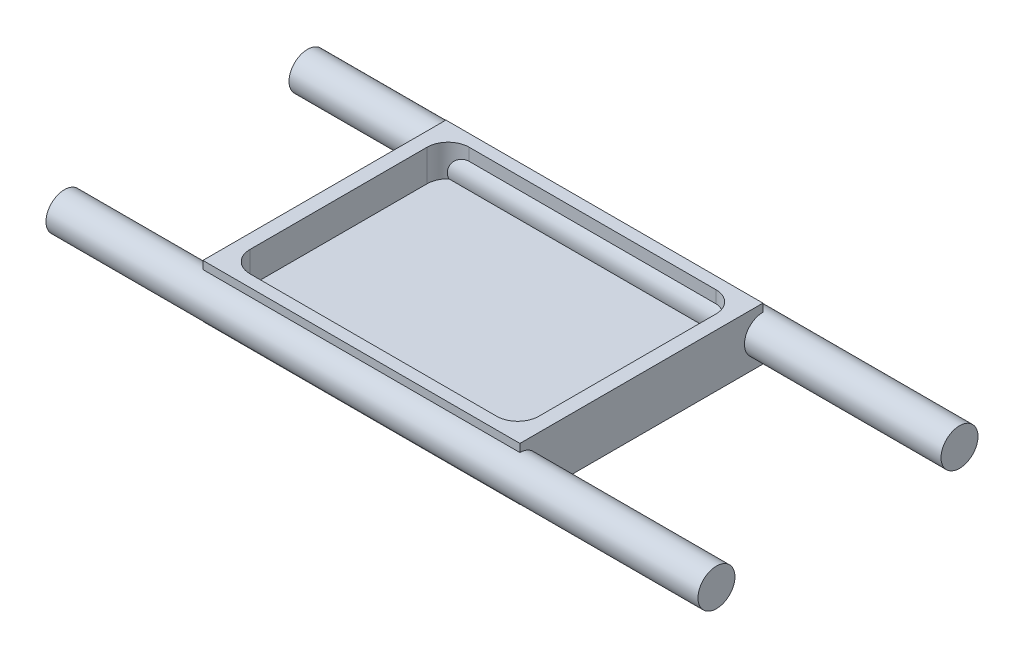
ISO-10303-21;
HEADER;
FILE_DESCRIPTION(('STEP AP214'),'2;1');
FILE_NAME('part.step','',(''),(''),'','','');
FILE_SCHEMA(('AUTOMOTIVE_DESIGN { 1 0 10303 214 1 1 1 1 }'));
ENDSEC;
DATA;
#1=APPLICATION_CONTEXT('core data for automotive mechanical design processes');
#2=APPLICATION_PROTOCOL_DEFINITION('international standard','automotive_design',2000,#1);
#3=PRODUCT_CONTEXT('',#1,'mechanical');
#4=PRODUCT('Part','Part','',(#3));
#5=PRODUCT_RELATED_PRODUCT_CATEGORY('part','',(#4));
#6=PRODUCT_DEFINITION_FORMATION('','',#4);
#7=PRODUCT_DEFINITION_CONTEXT('part definition',#1,'design');
#8=PRODUCT_DEFINITION('design','',#6,#7);
#9=PRODUCT_DEFINITION_SHAPE('','',#8);
#10=(LENGTH_UNIT() NAMED_UNIT(*) SI_UNIT(.MILLI.,.METRE.));
#11=(NAMED_UNIT(*) PLANE_ANGLE_UNIT() SI_UNIT($,.RADIAN.));
#12=(NAMED_UNIT(*) SI_UNIT($,.STERADIAN.) SOLID_ANGLE_UNIT());
#13=UNCERTAINTY_MEASURE_WITH_UNIT(LENGTH_MEASURE(1.E-05),#10,'distance_accuracy_value','');
#14=(GEOMETRIC_REPRESENTATION_CONTEXT(3) GLOBAL_UNCERTAINTY_ASSIGNED_CONTEXT((#13)) GLOBAL_UNIT_ASSIGNED_CONTEXT((#10,
#11,#12)) REPRESENTATION_CONTEXT('',''));
#15=CARTESIAN_POINT('',(0.,0.,0.));
#16=DIRECTION('',(0.,0.,1.));
#17=DIRECTION('',(1.,0.,0.));
#18=AXIS2_PLACEMENT_3D('',#15,#16,#17);
#19=CARTESIAN_POINT('',(116.702187757243,20.,83.7471960657648));
#20=DIRECTION('',(0.,1.,0.));
#21=DIRECTION('',(0.,0.,1.));
#22=AXIS2_PLACEMENT_3D('',#19,#20,#21);
#23=PLANE('',#22);
#24=CARTESIAN_POINT('',(-116.702187757243,20.,83.7471960657648));
#25=DIRECTION('',(0.,1.,0.));
#26=DIRECTION('',(0.,0.,1.));
#27=AXIS2_PLACEMENT_3D('',#24,#25,#26);
#28=CIRCLE('',#27,20.);
#29=CARTESIAN_POINT('',(-136.702187757243,20.,83.7471960657646));
#30=VERTEX_POINT('',#29);
#31=CARTESIAN_POINT('',(-130.495778932662,20.,98.2294901687516));
#32=VERTEX_POINT('',#31);
#33=EDGE_CURVE('E289',#30,#32,#28,.T.);
#34=ORIENTED_EDGE('',*,*,#33,.T.);
#35=DIRECTION('',(-1.,0.,0.));
#36=VECTOR('',#35,1.);
#37=CARTESIAN_POINT('',(336.,20.,98.2294901687515));
#38=LINE('',#37,#36);
#39=CARTESIAN_POINT('',(130.495778932662,20.,98.2294901687515));
#40=VERTEX_POINT('',#39);
#41=EDGE_CURVE('E198',#32,#40,#38,.F.);
#42=ORIENTED_EDGE('',*,*,#41,.T.);
#43=CARTESIAN_POINT('',(116.702187757243,20.,83.7471960657648));
#44=DIRECTION('',(0.,1.,0.));
#45=DIRECTION('',(0.,0.,1.));
#46=AXIS2_PLACEMENT_3D('',#43,#44,#45);
#47=CIRCLE('',#46,20.);
#48=CARTESIAN_POINT('',(136.702187757243,20.,83.7471960657646));
#49=VERTEX_POINT('',#48);
#50=EDGE_CURVE('E333',#40,#49,#47,.T.);
#51=ORIENTED_EDGE('',*,*,#50,.T.);
#52=DIRECTION('',(0.,0.,-1.));
#53=VECTOR('',#52,1.);
#54=CARTESIAN_POINT('',(136.702187757243,20.,-83.7471960657646));
#55=LINE('',#54,#53);
#56=CARTESIAN_POINT('',(136.702187757243,20.,-83.7471960657646));
#57=VERTEX_POINT('',#56);
#58=EDGE_CURVE('E409',#49,#57,#55,.T.);
#59=ORIENTED_EDGE('',*,*,#58,.T.);
#60=CARTESIAN_POINT('',(116.702187757243,20.,-83.7471960657648));
#61=DIRECTION('',(0.,1.,0.));
#62=DIRECTION('',(0.,0.,-1.));
#63=AXIS2_PLACEMENT_3D('',#60,#61,#62);
#64=CIRCLE('',#63,20.);
#65=CARTESIAN_POINT('',(130.495778932662,20.,-98.2294901687516));
#66=VERTEX_POINT('',#65);
#67=EDGE_CURVE('E402',#57,#66,#64,.T.);
#68=ORIENTED_EDGE('',*,*,#67,.T.);
#69=DIRECTION('',(-1.,0.,0.));
#70=VECTOR('',#69,1.);
#71=CARTESIAN_POINT('',(336.,20.,-98.2294901687517));
#72=LINE('',#71,#70);
#73=CARTESIAN_POINT('',(-130.495778932662,20.,-98.2294901687516));
#74=VERTEX_POINT('',#73);
#75=EDGE_CURVE('E54',#66,#74,#72,.T.);
#76=ORIENTED_EDGE('',*,*,#75,.T.);
#77=CARTESIAN_POINT('',(-116.702187757243,20.,-83.7471960657648));
#78=DIRECTION('',(0.,1.,0.));
#79=DIRECTION('',(0.,0.,1.));
#80=AXIS2_PLACEMENT_3D('',#77,#78,#79);
#81=CIRCLE('',#80,20.);
#82=CARTESIAN_POINT('',(-136.702187757243,20.,-83.7471960657646));
#83=VERTEX_POINT('',#82);
#84=EDGE_CURVE('E300',#74,#83,#81,.T.);
#85=ORIENTED_EDGE('',*,*,#84,.T.);
#86=DIRECTION('',(0.,0.,1.));
#87=VECTOR('',#86,1.);
#88=CARTESIAN_POINT('',(-136.702187757243,20.,-83.7471960657646));
#89=LINE('',#88,#87);
#90=EDGE_CURVE('E291',#83,#30,#89,.T.);
#91=ORIENTED_EDGE('',*,*,#90,.T.);
#92=EDGE_LOOP('',(#34,#42,#51,#59,#68,#76,#85,#91));
#93=FACE_BOUND('',#92,.T.);
#94=ADVANCED_FACE('F39',(#93),#23,.T.);
#95=CARTESIAN_POINT('',(150.,50.,115.));
#96=DIRECTION('',(0.,0.,-1.));
#97=DIRECTION('',(-1.,0.,0.));
#98=AXIS2_PLACEMENT_3D('',#95,#96,#97);
#99=PLANE('',#98);
#100=DIRECTION('',(-1.,0.,0.));
#101=VECTOR('',#100,1.);
#102=CARTESIAN_POINT('',(336.,7.5,115.));
#103=LINE('',#102,#101);
#104=CARTESIAN_POINT('',(-150.,7.49999999999999,115.));
#105=VERTEX_POINT('',#104);
#106=CARTESIAN_POINT('',(150.,7.5,115.));
#107=VERTEX_POINT('',#106);
#108=EDGE_CURVE('E61',#105,#107,#103,.F.);
#109=ORIENTED_EDGE('',*,*,#108,.F.);
#110=DIRECTION('',(0.,-1.,0.));
#111=VECTOR('',#110,1.);
#112=CARTESIAN_POINT('',(-150.,50.,115.));
#113=LINE('',#112,#111);
#114=CARTESIAN_POINT('',(-150.,0.,115.));
#115=VERTEX_POINT('',#114);
#116=EDGE_CURVE('E392',#105,#115,#113,.T.);
#117=ORIENTED_EDGE('',*,*,#116,.T.);
#118=DIRECTION('',(1.,0.,0.));
#119=VECTOR('',#118,1.);
#120=CARTESIAN_POINT('',(150.,0.,115.));
#121=LINE('',#120,#119);
#122=CARTESIAN_POINT('',(150.,0.,115.));
#123=VERTEX_POINT('',#122);
#124=EDGE_CURVE('E368',#115,#123,#121,.T.);
#125=ORIENTED_EDGE('',*,*,#124,.T.);
#126=DIRECTION('',(0.,-1.,0.));
#127=VECTOR('',#126,1.);
#128=CARTESIAN_POINT('',(150.,50.,115.));
#129=LINE('',#128,#127);
#130=EDGE_CURVE('E388',#107,#123,#129,.T.);
#131=ORIENTED_EDGE('',*,*,#130,.F.);
#132=EDGE_LOOP('',(#109,#117,#125,#131));
#133=FACE_BOUND('',#132,.T.);
#134=ADVANCED_FACE('F283',(#133),#99,.F.);
#135=DIRECTION('',(-1.,0.,0.));
#136=VECTOR('',#135,1.);
#137=CARTESIAN_POINT('',(336.,42.5,115.));
#138=LINE('',#137,#136);
#139=CARTESIAN_POINT('',(150.,42.5,115.));
#140=VERTEX_POINT('',#139);
#141=CARTESIAN_POINT('',(-150.,42.5,115.));
#142=VERTEX_POINT('',#141);
#143=EDGE_CURVE('E207',#140,#142,#138,.T.);
#144=ORIENTED_EDGE('',*,*,#143,.F.);
#145=CARTESIAN_POINT('',(150.,50.,115.));
#146=VERTEX_POINT('',#145);
#147=EDGE_CURVE('E389',#146,#140,#129,.T.);
#148=ORIENTED_EDGE('',*,*,#147,.F.);
#149=DIRECTION('',(1.,0.,0.));
#150=VECTOR('',#149,1.);
#151=CARTESIAN_POINT('',(150.,50.,115.));
#152=LINE('',#151,#150);
#153=CARTESIAN_POINT('',(-150.,50.,115.));
#154=VERTEX_POINT('',#153);
#155=EDGE_CURVE('E354',#154,#146,#152,.T.);
#156=ORIENTED_EDGE('',*,*,#155,.F.);
#157=EDGE_CURVE('E393',#154,#142,#113,.T.);
#158=ORIENTED_EDGE('',*,*,#157,.T.);
#159=EDGE_LOOP('',(#144,#148,#156,#158));
#160=FACE_BOUND('',#159,.T.);
#161=ADVANCED_FACE('F287',(#160),#99,.F.);
#162=CARTESIAN_POINT('',(116.702187757243,20.,83.7471960657648));
#163=DIRECTION('',(0.,1.,0.));
#164=DIRECTION('',(0.,0.,1.));
#165=AXIS2_PLACEMENT_3D('',#162,#163,#164);
#166=CYLINDRICAL_SURFACE('',#165,20.);
#167=CARTESIAN_POINT('',(116.702187757243,38.402402904616,103.747196065765));
#168=CARTESIAN_POINT('',(116.906678555119,38.4023982148654,103.747197549759));
#169=CARTESIAN_POINT('',(117.111147008417,38.3997698950823,103.744059143717));
#170=CARTESIAN_POINT('',(117.519758220783,38.3892323205855,103.731523876265));
#171=CARTESIAN_POINT('',(117.723900975679,38.381322998747,103.722126935306));
#172=CARTESIAN_POINT('',(118.335415928774,38.3496228799349,103.684580138223));
#173=CARTESIAN_POINT('',(118.741870231253,38.3178599282645,103.647074308818));
#174=CARTESIAN_POINT('',(119.550782386161,38.232332580036,103.547503579904));
#175=CARTESIAN_POINT('',(119.953222278895,38.1784948021762,103.485356791693));
#176=CARTESIAN_POINT('',(120.749958737994,38.0478206758061,103.337491173336));
#177=CARTESIAN_POINT('',(121.144255821356,37.9709857922422,103.251773844693));
#178=CARTESIAN_POINT('',(121.922686521989,37.7928214154587,103.058012179541));
#179=CARTESIAN_POINT('',(122.306795177996,37.6914370015051,102.949917862365));
#180=CARTESIAN_POINT('',(123.0608799563,37.4627657818275,102.71356467234));
#181=CARTESIAN_POINT('',(123.430855797211,37.3354784606944,102.585305398266));
#182=CARTESIAN_POINT('',(124.152901674959,37.0537141206852,102.311561621555));
#183=CARTESIAN_POINT('',(124.505001238333,36.8992839508913,102.16610693791));
#184=CARTESIAN_POINT('',(125.188814340381,36.5617350569814,101.861203806826));
#185=CARTESIAN_POINT('',(125.520529436823,36.3786185288641,101.701756430967));
#186=CARTESIAN_POINT('',(126.14481796031,35.9924868112782,101.381077852782));
#187=CARTESIAN_POINT('',(126.438514251678,35.7908942278777,101.220320532756));
#188=CARTESIAN_POINT('',(127.002438854527,35.3606010409812,100.893943903815));
#189=CARTESIAN_POINT('',(127.272667794866,35.1319011642715,100.728324725343));
#190=CARTESIAN_POINT('',(127.787658094589,34.6477883181661,100.396705421904));
#191=CARTESIAN_POINT('',(128.0324251397,34.3923813382117,100.230705390483));
#192=CARTESIAN_POINT('',(128.495129853448,33.8558726553782,99.9029050349177));
#193=CARTESIAN_POINT('',(128.713069715974,33.5747730568863,99.7411043682115));
#194=CARTESIAN_POINT('',(129.10138429332,33.017240185324,99.4415929971519));
#195=CARTESIAN_POINT('',(129.274324760467,32.7430235673885,99.3030715526013));
#196=CARTESIAN_POINT('',(129.59748137678,32.1768207632072,99.0362549682168));
#197=CARTESIAN_POINT('',(129.747699088705,31.8848358009195,98.9079591254037));
#198=CARTESIAN_POINT('',(130.025530733543,31.2851105286713,98.6643904250831));
#199=CARTESIAN_POINT('',(130.153144409995,30.9773700400021,98.5491177153394));
#200=CARTESIAN_POINT('',(130.386126080873,30.3483717397815,98.3340048180601));
#201=CARTESIAN_POINT('',(130.491493835402,30.0271137825034,98.2341647969527));
#202=CARTESIAN_POINT('',(130.678463543689,29.3804273462564,98.0538459191288));
#203=CARTESIAN_POINT('',(130.760523828605,29.055233380437,97.973000025673));
#204=CARTESIAN_POINT('',(130.904313236955,28.396463241906,97.8294530235794));
#205=CARTESIAN_POINT('',(130.966042635065,28.0628871825052,97.7667516698033));
#206=CARTESIAN_POINT('',(131.069652522413,27.3895117621489,97.6605517941767));
#207=CARTESIAN_POINT('',(131.111524821793,27.0497098933292,97.6170611961108));
#208=CARTESIAN_POINT('',(131.175736566064,26.3663195864909,97.550041385027));
#209=CARTESIAN_POINT('',(131.198076068006,26.022731159535,97.5265121137067));
#210=CARTESIAN_POINT('',(131.223762676074,25.3248965278887,97.4994406076796));
#211=CARTESIAN_POINT('',(131.226589326622,24.970609728778,97.4964460990648));
#212=CARTESIAN_POINT('',(131.21189855951,24.2628819916408,97.5119482638744));
#213=CARTESIAN_POINT('',(131.194378440632,23.9094411721686,97.530447790828));
#214=CARTESIAN_POINT('',(131.138857428451,23.2063840889272,97.5885898332626));
#215=CARTESIAN_POINT('',(131.100882748796,22.8567635131361,97.6282052868428));
#216=CARTESIAN_POINT('',(131.004140262143,22.1634984925939,97.7278600412149));
#217=CARTESIAN_POINT('',(130.945382126178,21.8198513461617,97.7878898422287));
#218=CARTESIAN_POINT('',(130.824450606666,21.2281980571968,97.9093651550697));
#219=CARTESIAN_POINT('',(130.767036458389,20.9783111739401,97.9664813444122));
#220=CARTESIAN_POINT('',(130.64035269745,20.4845323312502,98.0906702396517));
#221=CARTESIAN_POINT('',(130.571102258839,20.2406313944857,98.1577268197817));
#222=CARTESIAN_POINT('',(130.495778932662,20.,98.2294901687515));
#223=B_SPLINE_CURVE_WITH_KNOTS('',3,(#167,#168,#169,#170,#171,#172,#173,#174,#175,#176,#177,
#178,#179,#180,#181,#182,#183,#184,#185,#186,#187,#188,#189,#190,#191,#192,#193,#194,#195,#196,
#197,#198,#199,#200,#201,#202,#203,#204,#205,#206,#207,#208,#209,#210,#211,#212,#213,#214,#215,
#216,#217,#218,#219,#220,#221,#222),.UNSPECIFIED.,.F.,.F.,(4,2,2,2,2,2,2,2,2,2,2,2,2,2,2,2,2,2,
2,2,2,2,2,2,2,2,2,4),(0.,0.613386562839971,1.22678092236991,2.4535833538538,3.68449742709596,
4.91533310615338,6.14894819837058,7.38258783912748,8.61411873767099,9.84555540606094,
11.0163945845631,12.1872023782509,13.3577481627742,14.528198158005,15.5845428445919,
16.6408148479144,17.6970988347694,18.7533942119454,19.7871946675048,20.8209811554494,
21.8551936479734,22.8894031197929,23.9510944440059,25.0129267335365,26.0734014528778,
27.1333833560656,27.920930975617,28.7072147035561),.UNSPECIFIED.);
#224=CARTESIAN_POINT('',(116.702187757243,38.4024029046161,103.747196065765));
#225=VERTEX_POINT('',#224);
#226=EDGE_CURVE('E193',#225,#40,#223,.T.);
#227=ORIENTED_EDGE('',*,*,#226,.F.);
#228=DIRECTION('',(0.,1.,0.));
#229=VECTOR('',#228,1.);
#230=CARTESIAN_POINT('',(116.702187757243,20.,103.747196065765));
#231=LINE('',#230,#229);
#232=CARTESIAN_POINT('',(116.702187757243,50.,103.747196065765));
#233=VERTEX_POINT('',#232);
#234=EDGE_CURVE('E183',#225,#233,#231,.T.);
#235=ORIENTED_EDGE('',*,*,#234,.T.);
#236=CARTESIAN_POINT('',(116.702187757243,50.,83.7471960657648));
#237=DIRECTION('',(0.,1.,0.));
#238=DIRECTION('',(0.,0.,1.));
#239=AXIS2_PLACEMENT_3D('',#236,#237,#238);
#240=CIRCLE('',#239,20.);
#241=CARTESIAN_POINT('',(136.702187757243,50.,83.7471960657646));
#242=VERTEX_POINT('',#241);
#243=EDGE_CURVE('E304',#233,#242,#240,.T.);
#244=ORIENTED_EDGE('',*,*,#243,.T.);
#245=DIRECTION('',(0.,1.,0.));
#246=VECTOR('',#245,1.);
#247=CARTESIAN_POINT('',(136.702187757243,20.,83.7471960657646));
#248=LINE('',#247,#246);
#249=EDGE_CURVE('E293',#49,#242,#248,.T.);
#250=ORIENTED_EDGE('',*,*,#249,.F.);
#251=ORIENTED_EDGE('',*,*,#50,.F.);
#252=EDGE_LOOP('',(#227,#235,#244,#250,#251));
#253=FACE_BOUND('',#252,.T.);
#254=ADVANCED_FACE('F514',(#253),#166,.F.);
#255=CARTESIAN_POINT('',(116.702187757243,20.,103.747196065765));
#256=DIRECTION('',(0.,0.,1.));
#257=DIRECTION('',(1.,0.,0.));
#258=AXIS2_PLACEMENT_3D('',#255,#256,#257);
#259=PLANE('',#258);
#260=DIRECTION('',(-1.,0.,0.));
#261=VECTOR('',#260,1.);
#262=CARTESIAN_POINT('',(336.,38.4024029046161,103.747196065765));
#263=LINE('',#262,#261);
#264=CARTESIAN_POINT('',(-116.702187757243,38.402402904616,103.747196065765));
#265=VERTEX_POINT('',#264);
#266=EDGE_CURVE('E188',#265,#225,#263,.F.);
#267=ORIENTED_EDGE('',*,*,#266,.F.);
#268=DIRECTION('',(0.,1.,0.));
#269=VECTOR('',#268,1.);
#270=CARTESIAN_POINT('',(-116.702187757243,20.,103.747196065765));
#271=LINE('',#270,#269);
#272=CARTESIAN_POINT('',(-116.702187757243,50.,103.747196065765));
#273=VERTEX_POINT('',#272);
#274=EDGE_CURVE('E172',#265,#273,#271,.T.);
#275=ORIENTED_EDGE('',*,*,#274,.T.);
#276=DIRECTION('',(1.,0.,0.));
#277=VECTOR('',#276,1.);
#278=CARTESIAN_POINT('',(116.702187757243,50.,103.747196065765));
#279=LINE('',#278,#277);
#280=EDGE_CURVE('E330',#273,#233,#279,.T.);
#281=ORIENTED_EDGE('',*,*,#280,.T.);
#282=ORIENTED_EDGE('',*,*,#234,.F.);
#283=EDGE_LOOP('',(#267,#275,#281,#282));
#284=FACE_BOUND('',#283,.T.);
#285=ADVANCED_FACE('F189',(#284),#259,.F.);
#286=CARTESIAN_POINT('',(-116.702187757243,20.,83.7471960657648));
#287=DIRECTION('',(0.,1.,0.));
#288=DIRECTION('',(0.,0.,1.));
#289=AXIS2_PLACEMENT_3D('',#286,#287,#288);
#290=CYLINDRICAL_SURFACE('',#289,20.);
#291=CARTESIAN_POINT('',(-130.495778932662,20.,98.2294901687516));
#292=CARTESIAN_POINT('',(-130.546741316716,20.1628075986875,98.1809478814501));
#293=CARTESIAN_POINT('',(-130.594921225318,20.327100266472,98.1345500009642));
#294=CARTESIAN_POINT('',(-130.685790891793,20.658381013713,98.0462475801304));
#295=CARTESIAN_POINT('',(-130.728480894039,20.8253689728216,98.0043428397934));
#296=CARTESIAN_POINT('',(-130.848404405702,21.3298584160214,97.885698813836));
#297=CARTESIAN_POINT('',(-130.917529863816,21.6710090631282,97.8159926877008));
#298=CARTESIAN_POINT('',(-131.034584353247,22.3601202085712,97.6967258566716));
#299=CARTESIAN_POINT('',(-131.08252626304,22.7080764347253,97.6471529133544));
#300=CARTESIAN_POINT('',(-131.157708641062,23.4085668879998,97.5689493620321));
#301=CARTESIAN_POINT('',(-131.184948566685,23.7611012348679,97.5403193029474));
#302=CARTESIAN_POINT('',(-131.218977070858,24.4681891220482,97.5045010042034));
#303=CARTESIAN_POINT('',(-131.225768293629,24.8227423953521,97.4973099922624));
#304=CARTESIAN_POINT('',(-131.21897478072,25.5314362268407,97.5044820892801));
#305=CARTESIAN_POINT('',(-131.205390072547,25.8855767855821,97.5188451691414));
#306=CARTESIAN_POINT('',(-131.157712588109,26.5909500169351,97.5688817023909));
#307=CARTESIAN_POINT('',(-131.123620534872,26.9421827916238,97.6045544044654));
#308=CARTESIAN_POINT('',(-131.034613199895,27.6392609609579,97.6965929755707));
#309=CARTESIAN_POINT('',(-130.97969794996,27.985106363831,97.7529588129954));
#310=CARTESIAN_POINT('',(-130.848215524786,28.6708371823761,97.885748730838));
#311=CARTESIAN_POINT('',(-130.771528230852,29.010678100301,97.9622839146784));
#312=CARTESIAN_POINT('',(-130.596082748235,29.6798507326629,98.1338120534347));
#313=CARTESIAN_POINT('',(-130.49732449543,30.009182416565,98.228805061975));
#314=CARTESIAN_POINT('',(-130.277222833069,30.6547695442656,98.4353264389935));
#315=CARTESIAN_POINT('',(-130.155884837151,30.9710281002642,98.5468508426628));
#316=CARTESIAN_POINT('',(-129.89017969727,31.588168283099,98.7841028565211));
#317=CARTESIAN_POINT('',(-129.745813198629,31.8890503405154,98.9098300686793));
#318=CARTESIAN_POINT('',(-129.437449916046,32.4665024094295,99.1696724528782));
#319=CARTESIAN_POINT('',(-129.273984220624,32.7434737102866,99.3035264533447));
#320=CARTESIAN_POINT('',(-128.924970813434,33.2789034792631,99.5792206280838));
#321=CARTESIAN_POINT('',(-128.739423547158,33.5373623206985,99.7210606412103));
#322=CARTESIAN_POINT('',(-128.346722645938,34.0343201370801,100.009549282367));
#323=CARTESIAN_POINT('',(-128.139572855471,34.2728226499686,100.156197051614));
#324=CARTESIAN_POINT('',(-127.704453044366,34.7289377768198,100.451064037359));
#325=CARTESIAN_POINT('',(-127.476482978625,34.9465503455272,100.59928325726));
#326=CARTESIAN_POINT('',(-127.003091293488,35.3584446134596,100.892697085924));
#327=CARTESIAN_POINT('',(-126.757850123606,35.5529230731944,101.037906983957));
#328=CARTESIAN_POINT('',(-126.24951407163,35.9207668956865,101.323702340586));
#329=CARTESIAN_POINT('',(-125.986419300764,36.0941323899584,101.464287827983));
#330=CARTESIAN_POINT('',(-125.443940094649,36.4200896622895,101.738141285865));
#331=CARTESIAN_POINT('',(-125.164550674407,36.572675035004,101.871406992553));
#332=CARTESIAN_POINT('',(-124.591340577022,36.8575956461687,102.128161937694));
#333=CARTESIAN_POINT('',(-124.297519433479,36.98993022959,102.251650859846));
#334=CARTESIAN_POINT('',(-123.678509757175,37.2428048084019,102.494148139042));
#335=CARTESIAN_POINT('',(-123.352508891205,37.3620886570191,102.612392638983));
#336=CARTESIAN_POINT('',(-122.688516477909,37.5797429508356,102.83348273702));
#337=CARTESIAN_POINT('',(-122.350523922966,37.6781116337305,102.936327037283));
#338=CARTESIAN_POINT('',(-121.664660720889,37.8550303699769,103.125029320662));
#339=CARTESIAN_POINT('',(-121.316787232618,37.9335746575615,103.21088236044));
#340=CARTESIAN_POINT('',(-120.61339883619,38.0717969181845,103.364330571066));
#341=CARTESIAN_POINT('',(-120.257885050671,38.1314776430029,103.431928404738));
#342=CARTESIAN_POINT('',(-119.636800911794,38.2193045883344,103.532518102867));
#343=CARTESIAN_POINT('',(-119.372515901255,38.2516160784232,103.569931423586));
#344=CARTESIAN_POINT('',(-118.841716749693,38.3067998175731,103.634223667836));
#345=CARTESIAN_POINT('',(-118.57520292158,38.3296733696828,103.661104045572));
#346=CARTESIAN_POINT('',(-118.041320117753,38.3661367233247,103.704105845422));
#347=CARTESIAN_POINT('',(-117.77395466873,38.3797484118908,103.720252630367));
#348=CARTESIAN_POINT('',(-117.238455342741,38.397875076389,103.741804245095));
#349=CARTESIAN_POINT('',(-116.970321388939,38.4023891085238,103.747207960384));
#350=CARTESIAN_POINT('',(-116.702187757243,38.402402904616,103.747196065765));
#351=B_SPLINE_CURVE_WITH_KNOTS('',3,(#291,#292,#293,#294,#295,#296,#297,#298,#299,#300,#301,
#302,#303,#304,#305,#306,#307,#308,#309,#310,#311,#312,#313,#314,#315,#316,#317,#318,#319,#320,
#321,#322,#323,#324,#325,#326,#327,#328,#329,#330,#331,#332,#333,#334,#335,#336,#337,#338,#339,
#340,#341,#342,#343,#344,#345,#346,#347,#348,#349,#350),.UNSPECIFIED.,.F.,.F.,(4,2,2,2,2,2,2,2,
2,2,2,2,2,2,2,2,2,2,2,2,2,2,2,2,2,2,2,2,2,4),(0.,0.532021142046328,1.06401859406782,
2.12761093314578,3.19055577171009,4.2535284694336,5.31636370825868,6.37919751228727,
7.44199384618535,8.50478855681236,9.5735647299243,10.6423440081337,11.7108673690481,
12.7793607922479,13.8231479072745,14.8669139677165,15.9104945910983,16.9540774752074,
17.9880304866704,19.0219770572121,20.0562416175307,21.0905396249342,22.1895561703436,
23.288665281825,24.388093692997,25.4873616475899,26.2936097899957,27.0997465804918,
27.9039716825504,28.7082802112048),.UNSPECIFIED.);
#352=EDGE_CURVE('E11',#32,#265,#351,.T.);
#353=ORIENTED_EDGE('',*,*,#352,.F.);
#354=ORIENTED_EDGE('',*,*,#33,.F.);
#355=DIRECTION('',(0.,1.,0.));
#356=VECTOR('',#355,1.);
#357=CARTESIAN_POINT('',(-136.702187757243,20.,83.7471960657646));
#358=LINE('',#357,#356);
#359=CARTESIAN_POINT('',(-136.702187757243,50.,83.7471960657646));
#360=VERTEX_POINT('',#359);
#361=EDGE_CURVE('E184',#30,#360,#358,.T.);
#362=ORIENTED_EDGE('',*,*,#361,.T.);
#363=CARTESIAN_POINT('',(-116.702187757243,50.,83.7471960657648));
#364=DIRECTION('',(0.,1.,0.));
#365=DIRECTION('',(0.,0.,1.));
#366=AXIS2_PLACEMENT_3D('',#363,#364,#365);
#367=CIRCLE('',#366,20.);
#368=EDGE_CURVE('E178',#360,#273,#367,.T.);
#369=ORIENTED_EDGE('',*,*,#368,.T.);
#370=ORIENTED_EDGE('',*,*,#274,.F.);
#371=EDGE_LOOP('',(#353,#354,#362,#369,#370));
#372=FACE_BOUND('',#371,.T.);
#373=ADVANCED_FACE('F174',(#372),#290,.F.);
#374=CARTESIAN_POINT('',(150.,50.,-115.));
#375=DIRECTION('',(0.,0.,1.));
#376=DIRECTION('',(1.,0.,0.));
#377=AXIS2_PLACEMENT_3D('',#374,#375,#376);
#378=PLANE('',#377);
#379=DIRECTION('',(-1.,0.,0.));
#380=VECTOR('',#379,1.);
#381=CARTESIAN_POINT('',(336.,42.5,-115.));
#382=LINE('',#381,#380);
#383=CARTESIAN_POINT('',(-150.,42.5,-115.));
#384=VERTEX_POINT('',#383);
#385=CARTESIAN_POINT('',(150.,42.5,-115.));
#386=VERTEX_POINT('',#385);
#387=EDGE_CURVE('E308',#384,#386,#382,.F.);
#388=ORIENTED_EDGE('',*,*,#387,.F.);
#389=DIRECTION('',(0.,-1.,0.));
#390=VECTOR('',#389,1.);
#391=CARTESIAN_POINT('',(-150.,50.,-115.));
#392=LINE('',#391,#390);
#393=CARTESIAN_POINT('',(-150.,50.,-115.));
#394=VERTEX_POINT('',#393);
#395=EDGE_CURVE('E379',#394,#384,#392,.T.);
#396=ORIENTED_EDGE('',*,*,#395,.F.);
#397=DIRECTION('',(-1.,0.,0.));
#398=VECTOR('',#397,1.);
#399=CARTESIAN_POINT('',(150.,50.,-115.));
#400=LINE('',#399,#398);
#401=CARTESIAN_POINT('',(150.,50.,-115.));
#402=VERTEX_POINT('',#401);
#403=EDGE_CURVE('E361',#402,#394,#400,.T.);
#404=ORIENTED_EDGE('',*,*,#403,.F.);
#405=DIRECTION('',(0.,-1.,0.));
#406=VECTOR('',#405,1.);
#407=CARTESIAN_POINT('',(150.,50.,-115.));
#408=LINE('',#407,#406);
#409=EDGE_CURVE('E384',#402,#386,#408,.T.);
#410=ORIENTED_EDGE('',*,*,#409,.T.);
#411=EDGE_LOOP('',(#388,#396,#404,#410));
#412=FACE_BOUND('',#411,.T.);
#413=ADVANCED_FACE('F456',(#412),#378,.F.);
#414=DIRECTION('',(-1.,0.,0.));
#415=VECTOR('',#414,1.);
#416=CARTESIAN_POINT('',(336.,7.50000000000001,-115.));
#417=LINE('',#416,#415);
#418=CARTESIAN_POINT('',(150.,7.50000000000001,-115.));
#419=VERTEX_POINT('',#418);
#420=CARTESIAN_POINT('',(-150.,7.50000000000001,-115.));
#421=VERTEX_POINT('',#420);
#422=EDGE_CURVE('E265',#419,#421,#417,.T.);
#423=ORIENTED_EDGE('',*,*,#422,.F.);
#424=CARTESIAN_POINT('',(150.,0.,-115.));
#425=VERTEX_POINT('',#424);
#426=EDGE_CURVE('E383',#419,#425,#408,.T.);
#427=ORIENTED_EDGE('',*,*,#426,.T.);
#428=DIRECTION('',(-1.,0.,0.));
#429=VECTOR('',#428,1.);
#430=CARTESIAN_POINT('',(150.,0.,-115.));
#431=LINE('',#430,#429);
#432=CARTESIAN_POINT('',(-150.,0.,-115.));
#433=VERTEX_POINT('',#432);
#434=EDGE_CURVE('E355',#425,#433,#431,.T.);
#435=ORIENTED_EDGE('',*,*,#434,.T.);
#436=EDGE_CURVE('E364',#421,#433,#392,.T.);
#437=ORIENTED_EDGE('',*,*,#436,.F.);
#438=EDGE_LOOP('',(#423,#427,#435,#437));
#439=FACE_BOUND('',#438,.T.);
#440=ADVANCED_FACE('F272',(#439),#378,.F.);
#441=CARTESIAN_POINT('',(-116.702187757243,20.,-83.7471960657648));
#442=DIRECTION('',(0.,1.,0.));
#443=DIRECTION('',(0.,0.,1.));
#444=AXIS2_PLACEMENT_3D('',#441,#442,#443);
#445=CYLINDRICAL_SURFACE('',#444,20.);
#446=CARTESIAN_POINT('',(-116.702187757243,38.402402904616,-103.747196065765));
#447=CARTESIAN_POINT('',(-116.906678555119,38.4023982148654,-103.747197549759));
#448=CARTESIAN_POINT('',(-117.111147008417,38.3997698950823,-103.744059143717));
#449=CARTESIAN_POINT('',(-117.519758220783,38.3892323205855,-103.731523876265));
#450=CARTESIAN_POINT('',(-117.723900975679,38.3813229987469,-103.722126935306));
#451=CARTESIAN_POINT('',(-118.335415928774,38.3496228799349,-103.684580138223));
#452=CARTESIAN_POINT('',(-118.741870231253,38.3178599282645,-103.647074308818));
#453=CARTESIAN_POINT('',(-119.550782386161,38.232332580036,-103.547503579904));
#454=CARTESIAN_POINT('',(-119.953222278895,38.1784948021762,-103.485356791693));
#455=CARTESIAN_POINT('',(-120.749958737994,38.0478206758061,-103.337491173336));
#456=CARTESIAN_POINT('',(-121.144255821357,37.9709857922422,-103.251773844693));
#457=CARTESIAN_POINT('',(-121.922686521989,37.7928214154587,-103.058012179541));
#458=CARTESIAN_POINT('',(-122.306795177996,37.6914370015051,-102.949917862365));
#459=CARTESIAN_POINT('',(-123.0608799563,37.4627657818275,-102.71356467234));
#460=CARTESIAN_POINT('',(-123.430855797211,37.3354784606943,-102.585305398266));
#461=CARTESIAN_POINT('',(-124.152901674959,37.0537141206851,-102.311561621555));
#462=CARTESIAN_POINT('',(-124.505001238333,36.8992839508912,-102.16610693791));
#463=CARTESIAN_POINT('',(-125.188814340381,36.5617350569813,-101.861203806826));
#464=CARTESIAN_POINT('',(-125.520529436823,36.3786185288641,-101.701756430967));
#465=CARTESIAN_POINT('',(-126.14481796031,35.9924868112782,-101.381077852782));
#466=CARTESIAN_POINT('',(-126.438514251678,35.7908942278777,-101.220320532756));
#467=CARTESIAN_POINT('',(-127.002438854527,35.3606010409812,-100.893943903815));
#468=CARTESIAN_POINT('',(-127.272667794866,35.1319011642715,-100.728324725343));
#469=CARTESIAN_POINT('',(-127.787658094589,34.6477883181661,-100.396705421904));
#470=CARTESIAN_POINT('',(-128.0324251397,34.3923813382117,-100.230705390483));
#471=CARTESIAN_POINT('',(-128.495129853448,33.8558726553782,-99.9029050349177));
#472=CARTESIAN_POINT('',(-128.713069715974,33.5747730568862,-99.7411043682115));
#473=CARTESIAN_POINT('',(-129.10138429332,33.017240185324,-99.4415929971519));
#474=CARTESIAN_POINT('',(-129.274324760467,32.7430235673885,-99.3030715526013));
#475=CARTESIAN_POINT('',(-129.59748137678,32.1768207632072,-99.0362549682168));
#476=CARTESIAN_POINT('',(-129.747699088705,31.8848358009194,-98.9079591254037));
#477=CARTESIAN_POINT('',(-130.025530733543,31.2851105286712,-98.6643904250831));
#478=CARTESIAN_POINT('',(-130.153144409995,30.9773700400021,-98.5491177153394));
#479=CARTESIAN_POINT('',(-130.386126080873,30.3483717397815,-98.3340048180601));
#480=CARTESIAN_POINT('',(-130.491493835402,30.0271137825034,-98.2341647969527));
#481=CARTESIAN_POINT('',(-130.678463543689,29.3804273462564,-98.0538459191288));
#482=CARTESIAN_POINT('',(-130.760523828605,29.055233380437,-97.973000025673));
#483=CARTESIAN_POINT('',(-130.904313236955,28.396463241906,-97.8294530235794));
#484=CARTESIAN_POINT('',(-130.966042635065,28.0628871825052,-97.7667516698033));
#485=CARTESIAN_POINT('',(-131.069652522413,27.3895117621489,-97.6605517941767));
#486=CARTESIAN_POINT('',(-131.111524821793,27.0497098933292,-97.6170611961108));
#487=CARTESIAN_POINT('',(-131.175736566064,26.3663195864909,-97.550041385027));
#488=CARTESIAN_POINT('',(-131.198076068006,26.0227311595349,-97.5265121137067));
#489=CARTESIAN_POINT('',(-131.223762676074,25.3248965278887,-97.4994406076796));
#490=CARTESIAN_POINT('',(-131.226589326622,24.970609728778,-97.4964460990649));
#491=CARTESIAN_POINT('',(-131.21189855951,24.2628819916408,-97.5119482638744));
#492=CARTESIAN_POINT('',(-131.194378440632,23.9094411721686,-97.530447790828));
#493=CARTESIAN_POINT('',(-131.138857428451,23.2063840889272,-97.5885898332627));
#494=CARTESIAN_POINT('',(-131.100882748796,22.8567635131361,-97.6282052868428));
#495=CARTESIAN_POINT('',(-131.004140262143,22.1634984925939,-97.7278600412149));
#496=CARTESIAN_POINT('',(-130.945382126178,21.8198513461617,-97.7878898422288));
#497=CARTESIAN_POINT('',(-130.824450606666,21.2281980571968,-97.9093651550697));
#498=CARTESIAN_POINT('',(-130.767036458389,20.9783111739401,-97.9664813444122));
#499=CARTESIAN_POINT('',(-130.64035269745,20.4845323312502,-98.0906702396517));
#500=CARTESIAN_POINT('',(-130.571102258839,20.2406313944857,-98.1577268197817));
#501=CARTESIAN_POINT('',(-130.495778932662,20.,-98.2294901687516));
#502=B_SPLINE_CURVE_WITH_KNOTS('',3,(#446,#447,#448,#449,#450,#451,#452,#453,#454,#455,#456,
#457,#458,#459,#460,#461,#462,#463,#464,#465,#466,#467,#468,#469,#470,#471,#472,#473,#474,#475,
#476,#477,#478,#479,#480,#481,#482,#483,#484,#485,#486,#487,#488,#489,#490,#491,#492,#493,#494,
#495,#496,#497,#498,#499,#500,#501),.UNSPECIFIED.,.F.,.F.,(4,2,2,2,2,2,2,2,2,2,2,2,2,2,2,2,2,2,
2,2,2,2,2,2,2,2,2,4),(0.,0.613386562839943,1.22678092236989,2.45358335385378,3.68449742709598,
4.91533310615338,6.14894819837057,7.38258783912747,8.61411873767098,9.84555540606092,
11.0163945845631,12.1872023782509,13.3577481627742,14.528198158005,15.5845428445919,
16.6408148479143,17.6970988347694,18.7533942119454,19.7871946675048,20.8209811554494,
21.8551936479734,22.8894031197929,23.9510944440059,25.0129267335365,26.0734014528778,
27.1333833560656,27.920930975617,28.7072147035561),.UNSPECIFIED.);
#503=CARTESIAN_POINT('',(-116.702187757243,38.4024029046159,-103.747196065765));
#504=VERTEX_POINT('',#503);
#505=EDGE_CURVE('E257',#504,#74,#502,.T.);
#506=ORIENTED_EDGE('',*,*,#505,.F.);
#507=DIRECTION('',(0.,1.,0.));
#508=VECTOR('',#507,1.);
#509=CARTESIAN_POINT('',(-116.702187757243,20.,-103.747196065765));
#510=LINE('',#509,#508);
#511=CARTESIAN_POINT('',(-116.702187757243,50.,-103.747196065765));
#512=VERTEX_POINT('',#511);
#513=EDGE_CURVE('E342',#504,#512,#510,.T.);
#514=ORIENTED_EDGE('',*,*,#513,.T.);
#515=CARTESIAN_POINT('',(-116.702187757243,50.,-83.7471960657648));
#516=DIRECTION('',(0.,1.,0.));
#517=DIRECTION('',(0.,0.,1.));
#518=AXIS2_PLACEMENT_3D('',#515,#516,#517);
#519=CIRCLE('',#518,20.);
#520=CARTESIAN_POINT('',(-136.702187757243,50.,-83.7471960657646));
#521=VERTEX_POINT('',#520);
#522=EDGE_CURVE('E320',#512,#521,#519,.T.);
#523=ORIENTED_EDGE('',*,*,#522,.T.);
#524=DIRECTION('',(0.,1.,0.));
#525=VECTOR('',#524,1.);
#526=CARTESIAN_POINT('',(-136.702187757243,20.,-83.7471960657646));
#527=LINE('',#526,#525);
#528=EDGE_CURVE('E339',#83,#521,#527,.T.);
#529=ORIENTED_EDGE('',*,*,#528,.F.);
#530=ORIENTED_EDGE('',*,*,#84,.F.);
#531=EDGE_LOOP('',(#506,#514,#523,#529,#530));
#532=FACE_BOUND('',#531,.T.);
#533=ADVANCED_FACE('F267',(#532),#445,.F.);
#534=CARTESIAN_POINT('',(116.702187757243,20.,-103.747196065765));
#535=DIRECTION('',(0.,0.,-1.));
#536=DIRECTION('',(-1.,0.,0.));
#537=AXIS2_PLACEMENT_3D('',#534,#535,#536);
#538=PLANE('',#537);
#539=DIRECTION('',(-1.,0.,0.));
#540=VECTOR('',#539,1.);
#541=CARTESIAN_POINT('',(336.,38.4024029046159,-103.747196065765));
#542=LINE('',#541,#540);
#543=CARTESIAN_POINT('',(116.702187757243,38.402402904616,-103.747196065765));
#544=VERTEX_POINT('',#543);
#545=EDGE_CURVE('E240',#544,#504,#542,.T.);
#546=ORIENTED_EDGE('',*,*,#545,.F.);
#547=DIRECTION('',(0.,1.,0.));
#548=VECTOR('',#547,1.);
#549=CARTESIAN_POINT('',(116.702187757243,20.,-103.747196065765));
#550=LINE('',#549,#548);
#551=CARTESIAN_POINT('',(116.702187757243,50.,-103.747196065765));
#552=VERTEX_POINT('',#551);
#553=EDGE_CURVE('E345',#544,#552,#550,.T.);
#554=ORIENTED_EDGE('',*,*,#553,.T.);
#555=DIRECTION('',(-1.,0.,0.));
#556=VECTOR('',#555,1.);
#557=CARTESIAN_POINT('',(116.702187757243,50.,-103.747196065765));
#558=LINE('',#557,#556);
#559=EDGE_CURVE('E316',#552,#512,#558,.T.);
#560=ORIENTED_EDGE('',*,*,#559,.T.);
#561=ORIENTED_EDGE('',*,*,#513,.F.);
#562=EDGE_LOOP('',(#546,#554,#560,#561));
#563=FACE_BOUND('',#562,.T.);
#564=ADVANCED_FACE('F271',(#563),#538,.F.);
#565=CARTESIAN_POINT('',(116.702187757243,20.,-83.7471960657648));
#566=DIRECTION('',(0.,1.,0.));
#567=DIRECTION('',(0.,0.,1.));
#568=AXIS2_PLACEMENT_3D('',#565,#566,#567);
#569=CYLINDRICAL_SURFACE('',#568,20.);
#570=CARTESIAN_POINT('',(130.495778932662,20.,-98.2294901687516));
#571=CARTESIAN_POINT('',(130.546741316717,20.1628075986875,-98.1809478814501));
#572=CARTESIAN_POINT('',(130.594921225318,20.327100266472,-98.1345500009642));
#573=CARTESIAN_POINT('',(130.685790891793,20.658381013713,-98.0462475801304));
#574=CARTESIAN_POINT('',(130.728480894039,20.8253689728216,-98.0043428397934));
#575=CARTESIAN_POINT('',(130.848404405702,21.3298584160214,-97.885698813836));
#576=CARTESIAN_POINT('',(130.917529863816,21.6710090631282,-97.8159926877008));
#577=CARTESIAN_POINT('',(131.034584353247,22.3601202085713,-97.6967258566717));
#578=CARTESIAN_POINT('',(131.08252626304,22.7080764347253,-97.6471529133544));
#579=CARTESIAN_POINT('',(131.157708641062,23.4085668879999,-97.5689493620321));
#580=CARTESIAN_POINT('',(131.184948566685,23.761101234868,-97.5403193029474));
#581=CARTESIAN_POINT('',(131.218977070858,24.4681891220482,-97.5045010042035));
#582=CARTESIAN_POINT('',(131.225768293629,24.8227423953521,-97.4973099922624));
#583=CARTESIAN_POINT('',(131.21897478072,25.5314362268408,-97.5044820892801));
#584=CARTESIAN_POINT('',(131.205390072547,25.8855767855821,-97.5188451691414));
#585=CARTESIAN_POINT('',(131.157712588109,26.5909500169351,-97.5688817023909));
#586=CARTESIAN_POINT('',(131.123620534872,26.9421827916238,-97.6045544044654));
#587=CARTESIAN_POINT('',(131.034613199895,27.6392609609579,-97.6965929755707));
#588=CARTESIAN_POINT('',(130.97969794996,27.985106363831,-97.7529588129954));
#589=CARTESIAN_POINT('',(130.848215524786,28.6708371823761,-97.885748730838));
#590=CARTESIAN_POINT('',(130.771528230852,29.010678100301,-97.9622839146784));
#591=CARTESIAN_POINT('',(130.596082748235,29.6798507326629,-98.1338120534347));
#592=CARTESIAN_POINT('',(130.49732449543,30.009182416565,-98.228805061975));
#593=CARTESIAN_POINT('',(130.277222833069,30.6547695442656,-98.4353264389936));
#594=CARTESIAN_POINT('',(130.155884837151,30.9710281002642,-98.5468508426629));
#595=CARTESIAN_POINT('',(129.89017969727,31.588168283099,-98.7841028565211));
#596=CARTESIAN_POINT('',(129.745813198629,31.8890503405154,-98.9098300686794));
#597=CARTESIAN_POINT('',(129.437449916046,32.4665024094295,-99.1696724528782));
#598=CARTESIAN_POINT('',(129.273984220624,32.7434737102866,-99.3035264533447));
#599=CARTESIAN_POINT('',(128.924970813434,33.2789034792631,-99.5792206280839));
#600=CARTESIAN_POINT('',(128.739423547158,33.5373623206984,-99.7210606412103));
#601=CARTESIAN_POINT('',(128.346722645938,34.0343201370801,-100.009549282367));
#602=CARTESIAN_POINT('',(128.139572855471,34.2728226499686,-100.156197051614));
#603=CARTESIAN_POINT('',(127.704453044366,34.7289377768198,-100.451064037359));
#604=CARTESIAN_POINT('',(127.476482978625,34.9465503455272,-100.59928325726));
#605=CARTESIAN_POINT('',(127.003091293488,35.3584446134596,-100.892697085924));
#606=CARTESIAN_POINT('',(126.757850123606,35.5529230731945,-101.037906983957));
#607=CARTESIAN_POINT('',(126.24951407163,35.9207668956865,-101.323702340586));
#608=CARTESIAN_POINT('',(125.986419300764,36.0941323899584,-101.464287827983));
#609=CARTESIAN_POINT('',(125.443940094649,36.4200896622895,-101.738141285865));
#610=CARTESIAN_POINT('',(125.164550674407,36.572675035004,-101.871406992553));
#611=CARTESIAN_POINT('',(124.591340577022,36.8575956461687,-102.128161937694));
#612=CARTESIAN_POINT('',(124.297519433479,36.98993022959,-102.251650859846));
#613=CARTESIAN_POINT('',(123.678509757174,37.2428048084018,-102.494148139042));
#614=CARTESIAN_POINT('',(123.352508891205,37.3620886570191,-102.612392638983));
#615=CARTESIAN_POINT('',(122.688516477909,37.5797429508356,-102.83348273702));
#616=CARTESIAN_POINT('',(122.350523922966,37.6781116337305,-102.936327037283));
#617=CARTESIAN_POINT('',(121.664660720889,37.8550303699769,-103.125029320662));
#618=CARTESIAN_POINT('',(121.316787232618,37.9335746575614,-103.21088236044));
#619=CARTESIAN_POINT('',(120.61339883619,38.0717969181845,-103.364330571066));
#620=CARTESIAN_POINT('',(120.257885050671,38.1314776430029,-103.431928404738));
#621=CARTESIAN_POINT('',(119.636800911794,38.2193045883344,-103.532518102867));
#622=CARTESIAN_POINT('',(119.372515901255,38.2516160784232,-103.569931423586));
#623=CARTESIAN_POINT('',(118.841716749693,38.3067998175731,-103.634223667836));
#624=CARTESIAN_POINT('',(118.57520292158,38.3296733696828,-103.661104045572));
#625=CARTESIAN_POINT('',(118.041320117753,38.3661367233247,-103.704105845422));
#626=CARTESIAN_POINT('',(117.77395466873,38.3797484118908,-103.720252630367));
#627=CARTESIAN_POINT('',(117.238455342741,38.397875076389,-103.741804245095));
#628=CARTESIAN_POINT('',(116.970321388939,38.4023891085238,-103.747207960384));
#629=CARTESIAN_POINT('',(116.702187757243,38.402402904616,-103.747196065765));
#630=B_SPLINE_CURVE_WITH_KNOTS('',3,(#570,#571,#572,#573,#574,#575,#576,#577,#578,#579,#580,
#581,#582,#583,#584,#585,#586,#587,#588,#589,#590,#591,#592,#593,#594,#595,#596,#597,#598,#599,
#600,#601,#602,#603,#604,#605,#606,#607,#608,#609,#610,#611,#612,#613,#614,#615,#616,#617,#618,
#619,#620,#621,#622,#623,#624,#625,#626,#627,#628,#629),.UNSPECIFIED.,.F.,.F.,(4,2,2,2,2,2,2,2,
2,2,2,2,2,2,2,2,2,2,2,2,2,2,2,2,2,2,2,2,2,4),(0.,0.532021142046325,1.06401859406782,
2.12761093314578,3.19055577171009,4.2535284694336,5.31636370825868,6.37919751228726,
7.44199384618535,8.50478855681236,9.57356472992429,10.6423440081337,11.7108673690481,
12.7793607922479,13.8231479072745,14.8669139677165,15.9104945910983,16.9540774752073,
17.9880304866704,19.0219770572121,20.0562416175307,21.0905396249342,22.1895561703436,
23.288665281825,24.388093692997,25.4873616475899,26.2936097899957,27.0997465804917,
27.9039716825504,28.7082802112047),.UNSPECIFIED.);
#631=EDGE_CURVE('E231',#66,#544,#630,.T.);
#632=ORIENTED_EDGE('',*,*,#631,.F.);
#633=ORIENTED_EDGE('',*,*,#67,.F.);
#634=DIRECTION('',(0.,1.,0.));
#635=VECTOR('',#634,1.);
#636=CARTESIAN_POINT('',(136.702187757243,20.,-83.7471960657646));
#637=LINE('',#636,#635);
#638=CARTESIAN_POINT('',(136.702187757243,50.,-83.7471960657646));
#639=VERTEX_POINT('',#638);
#640=EDGE_CURVE('E298',#57,#639,#637,.T.);
#641=ORIENTED_EDGE('',*,*,#640,.T.);
#642=CARTESIAN_POINT('',(116.702187757243,50.,-83.7471960657648));
#643=DIRECTION('',(0.,1.,0.));
#644=DIRECTION('',(0.,0.,-1.));
#645=AXIS2_PLACEMENT_3D('',#642,#643,#644);
#646=CIRCLE('',#645,20.);
#647=EDGE_CURVE('E312',#639,#552,#646,.T.);
#648=ORIENTED_EDGE('',*,*,#647,.T.);
#649=ORIENTED_EDGE('',*,*,#553,.F.);
#650=EDGE_LOOP('',(#632,#633,#641,#648,#649));
#651=FACE_BOUND('',#650,.T.);
#652=ADVANCED_FACE('F242',(#651),#569,.F.);
#653=CARTESIAN_POINT('',(-150.,50.,-115.));
#654=DIRECTION('',(1.,0.,0.));
#655=DIRECTION('',(0.,0.,-1.));
#656=AXIS2_PLACEMENT_3D('',#653,#654,#655);
#657=PLANE('',#656);
#658=CARTESIAN_POINT('',(-150.,25.,115.));
#659=DIRECTION('',(1.,0.,0.));
#660=DIRECTION('',(0.,0.,-1.));
#661=AXIS2_PLACEMENT_3D('',#658,#659,#660);
#662=CIRCLE('',#661,17.5);
#663=EDGE_CURVE('E68',#142,#105,#662,.F.);
#664=ORIENTED_EDGE('',*,*,#663,.F.);
#665=ORIENTED_EDGE('',*,*,#157,.F.);
#666=DIRECTION('',(0.,0.,1.));
#667=VECTOR('',#666,1.);
#668=CARTESIAN_POINT('',(-150.,50.,-115.));
#669=LINE('',#668,#667);
#670=EDGE_CURVE('E350',#394,#154,#669,.T.);
#671=ORIENTED_EDGE('',*,*,#670,.F.);
#672=ORIENTED_EDGE('',*,*,#395,.T.);
#673=CARTESIAN_POINT('',(-150.,25.,-115.));
#674=DIRECTION('',(1.,0.,0.));
#675=DIRECTION('',(0.,0.,-1.));
#676=AXIS2_PLACEMENT_3D('',#673,#674,#675);
#677=CIRCLE('',#676,17.5);
#678=EDGE_CURVE('E419',#421,#384,#677,.F.);
#679=ORIENTED_EDGE('',*,*,#678,.F.);
#680=ORIENTED_EDGE('',*,*,#436,.T.);
#681=DIRECTION('',(0.,0.,1.));
#682=VECTOR('',#681,1.);
#683=CARTESIAN_POINT('',(-150.,0.,-115.));
#684=LINE('',#683,#682);
#685=EDGE_CURVE('E335',#433,#115,#684,.T.);
#686=ORIENTED_EDGE('',*,*,#685,.T.);
#687=ORIENTED_EDGE('',*,*,#116,.F.);
#688=EDGE_LOOP('',(#664,#665,#671,#672,#679,#680,#686,#687));
#689=FACE_BOUND('',#688,.T.);
#690=ADVANCED_FACE('F41',(#689),#657,.F.);
#691=CARTESIAN_POINT('',(150.,50.,-115.));
#692=DIRECTION('',(-1.,0.,0.));
#693=DIRECTION('',(0.,0.,1.));
#694=AXIS2_PLACEMENT_3D('',#691,#692,#693);
#695=PLANE('',#694);
#696=CARTESIAN_POINT('',(150.,25.,115.));
#697=DIRECTION('',(-1.,0.,0.));
#698=DIRECTION('',(0.,0.,1.));
#699=AXIS2_PLACEMENT_3D('',#696,#697,#698);
#700=CIRCLE('',#699,17.5);
#701=EDGE_CURVE('E202',#107,#140,#700,.F.);
#702=ORIENTED_EDGE('',*,*,#701,.F.);
#703=ORIENTED_EDGE('',*,*,#130,.T.);
#704=DIRECTION('',(0.,0.,-1.));
#705=VECTOR('',#704,1.);
#706=CARTESIAN_POINT('',(150.,0.,-115.));
#707=LINE('',#706,#705);
#708=EDGE_CURVE('E372',#123,#425,#707,.T.);
#709=ORIENTED_EDGE('',*,*,#708,.T.);
#710=ORIENTED_EDGE('',*,*,#426,.F.);
#711=CARTESIAN_POINT('',(150.,25.,-115.));
#712=DIRECTION('',(-1.,0.,0.));
#713=DIRECTION('',(0.,0.,1.));
#714=AXIS2_PLACEMENT_3D('',#711,#712,#713);
#715=CIRCLE('',#714,17.5);
#716=EDGE_CURVE('E422',#386,#419,#715,.F.);
#717=ORIENTED_EDGE('',*,*,#716,.F.);
#718=ORIENTED_EDGE('',*,*,#409,.F.);
#719=DIRECTION('',(0.,0.,-1.));
#720=VECTOR('',#719,1.);
#721=CARTESIAN_POINT('',(150.,50.,-115.));
#722=LINE('',#721,#720);
#723=EDGE_CURVE('E358',#146,#402,#722,.T.);
#724=ORIENTED_EDGE('',*,*,#723,.F.);
#725=ORIENTED_EDGE('',*,*,#147,.T.);
#726=EDGE_LOOP('',(#702,#703,#709,#710,#717,#718,#724,#725));
#727=FACE_BOUND('',#726,.T.);
#728=ADVANCED_FACE('F432',(#727),#695,.F.);
#729=CARTESIAN_POINT('',(0.,50.,0.));
#730=DIRECTION('',(0.,-1.,0.));
#731=DIRECTION('',(0.,0.,-1.));
#732=AXIS2_PLACEMENT_3D('',#729,#730,#731);
#733=PLANE('',#732);
#734=DIRECTION('',(0.,0.,-1.));
#735=VECTOR('',#734,1.);
#736=CARTESIAN_POINT('',(136.702187757243,50.,-83.7471960657646));
#737=LINE('',#736,#735);
#738=EDGE_CURVE('E307',#242,#639,#737,.T.);
#739=ORIENTED_EDGE('',*,*,#738,.F.);
#740=ORIENTED_EDGE('',*,*,#243,.F.);
#741=ORIENTED_EDGE('',*,*,#280,.F.);
#742=ORIENTED_EDGE('',*,*,#368,.F.);
#743=DIRECTION('',(0.,0.,1.));
#744=VECTOR('',#743,1.);
#745=CARTESIAN_POINT('',(-136.702187757243,50.,-83.7471960657646));
#746=LINE('',#745,#744);
#747=EDGE_CURVE('E324',#521,#360,#746,.T.);
#748=ORIENTED_EDGE('',*,*,#747,.F.);
#749=ORIENTED_EDGE('',*,*,#522,.F.);
#750=ORIENTED_EDGE('',*,*,#559,.F.);
#751=ORIENTED_EDGE('',*,*,#647,.F.);
#752=EDGE_LOOP('',(#739,#740,#741,#742,#748,#749,#750,#751));
#753=FACE_BOUND('',#752,.T.);
#754=ORIENTED_EDGE('',*,*,#670,.T.);
#755=ORIENTED_EDGE('',*,*,#155,.T.);
#756=ORIENTED_EDGE('',*,*,#723,.T.);
#757=ORIENTED_EDGE('',*,*,#403,.T.);
#758=EDGE_LOOP('',(#754,#755,#756,#757));
#759=FACE_BOUND('',#758,.T.);
#760=ADVANCED_FACE('F453',(#753,#759),#733,.F.);
#761=CARTESIAN_POINT('',(0.,0.,0.));
#762=DIRECTION('',(0.,-1.,0.));
#763=DIRECTION('',(0.,0.,-1.));
#764=AXIS2_PLACEMENT_3D('',#761,#762,#763);
#765=PLANE('',#764);
#766=ORIENTED_EDGE('',*,*,#685,.F.);
#767=ORIENTED_EDGE('',*,*,#434,.F.);
#768=ORIENTED_EDGE('',*,*,#708,.F.);
#769=ORIENTED_EDGE('',*,*,#124,.F.);
#770=EDGE_LOOP('',(#766,#767,#768,#769));
#771=FACE_BOUND('',#770,.T.);
#772=ADVANCED_FACE('F442',(#771),#765,.T.);
#773=CARTESIAN_POINT('',(-136.702187757243,20.,-83.7471960657646));
#774=DIRECTION('',(-1.,0.,0.));
#775=DIRECTION('',(0.,0.,1.));
#776=AXIS2_PLACEMENT_3D('',#773,#774,#775);
#777=PLANE('',#776);
#778=ORIENTED_EDGE('',*,*,#747,.T.);
#779=ORIENTED_EDGE('',*,*,#361,.F.);
#780=ORIENTED_EDGE('',*,*,#90,.F.);
#781=ORIENTED_EDGE('',*,*,#528,.T.);
#782=EDGE_LOOP('',(#778,#779,#780,#781));
#783=FACE_BOUND('',#782,.T.);
#784=ADVANCED_FACE('F274',(#783),#777,.F.);
#785=CARTESIAN_POINT('',(136.702187757243,20.,-83.7471960657646));
#786=DIRECTION('',(1.,0.,0.));
#787=DIRECTION('',(0.,0.,-1.));
#788=AXIS2_PLACEMENT_3D('',#785,#786,#787);
#789=PLANE('',#788);
#790=ORIENTED_EDGE('',*,*,#738,.T.);
#791=ORIENTED_EDGE('',*,*,#640,.F.);
#792=ORIENTED_EDGE('',*,*,#58,.F.);
#793=ORIENTED_EDGE('',*,*,#249,.T.);
#794=EDGE_LOOP('',(#790,#791,#792,#793));
#795=FACE_BOUND('',#794,.T.);
#796=ADVANCED_FACE('F544',(#795),#789,.F.);
#797=CARTESIAN_POINT('',(336.,25.,-115.));
#798=DIRECTION('',(-1.,0.,0.));
#799=DIRECTION('',(0.,0.,1.));
#800=AXIS2_PLACEMENT_3D('',#797,#798,#799);
#801=CYLINDRICAL_SURFACE('',#800,17.5);
#802=ORIENTED_EDGE('',*,*,#545,.T.);
#803=ORIENTED_EDGE('',*,*,#505,.T.);
#804=ORIENTED_EDGE('',*,*,#75,.F.);
#805=ORIENTED_EDGE('',*,*,#631,.T.);
#806=EDGE_LOOP('',(#802,#803,#804,#805));
#807=FACE_BOUND('',#806,.T.);
#808=ADVANCED_FACE('F252',(#807),#801,.T.);
#809=CARTESIAN_POINT('',(-281.,25.,-115.));
#810=DIRECTION('',(1.,0.,0.));
#811=DIRECTION('',(0.,0.,-1.));
#812=AXIS2_PLACEMENT_3D('',#809,#810,#811);
#813=CIRCLE('',#812,17.5);
#814=CARTESIAN_POINT('',(-281.,25.,-132.5));
#815=VERTEX_POINT('',#814);
#816=EDGE_CURVE('E223',#815,#815,#813,.T.);
#817=ORIENTED_EDGE('',*,*,#816,.T.);
#818=EDGE_LOOP('',(#817));
#819=FACE_BOUND('',#818,.T.);
#820=CARTESIAN_POINT('',(336.,25.,-115.));
#821=DIRECTION('',(1.,0.,0.));
#822=DIRECTION('',(0.,0.,-1.));
#823=AXIS2_PLACEMENT_3D('',#820,#821,#822);
#824=CIRCLE('',#823,17.5);
#825=CARTESIAN_POINT('',(336.,25.,-132.5));
#826=VERTEX_POINT('',#825);
#827=EDGE_CURVE('E227',#826,#826,#824,.T.);
#828=ORIENTED_EDGE('',*,*,#827,.F.);
#829=EDGE_LOOP('',(#828));
#830=FACE_BOUND('',#829,.T.);
#831=ORIENTED_EDGE('',*,*,#678,.T.);
#832=ORIENTED_EDGE('',*,*,#387,.T.);
#833=ORIENTED_EDGE('',*,*,#716,.T.);
#834=ORIENTED_EDGE('',*,*,#422,.T.);
#835=EDGE_LOOP('',(#831,#832,#833,#834));
#836=FACE_BOUND('',#835,.T.);
#837=ADVANCED_FACE('F246',(#819,#830,#836),#801,.T.);
#838=CARTESIAN_POINT('',(336.,25.,-115.));
#839=DIRECTION('',(1.,0.,0.));
#840=DIRECTION('',(0.,0.,-1.));
#841=AXIS2_PLACEMENT_3D('',#838,#839,#840);
#842=PLANE('',#841);
#843=ORIENTED_EDGE('',*,*,#827,.T.);
#844=EDGE_LOOP('',(#843));
#845=FACE_BOUND('',#844,.T.);
#846=ADVANCED_FACE('F251',(#845),#842,.T.);
#847=CARTESIAN_POINT('',(-281.,25.,-115.));
#848=DIRECTION('',(1.,0.,0.));
#849=DIRECTION('',(0.,0.,-1.));
#850=AXIS2_PLACEMENT_3D('',#847,#848,#849);
#851=PLANE('',#850);
#852=ORIENTED_EDGE('',*,*,#816,.F.);
#853=EDGE_LOOP('',(#852));
#854=FACE_BOUND('',#853,.T.);
#855=ADVANCED_FACE('F595',(#854),#851,.F.);
#856=CARTESIAN_POINT('',(336.,25.,115.));
#857=DIRECTION('',(-1.,0.,0.));
#858=DIRECTION('',(0.,0.,1.));
#859=AXIS2_PLACEMENT_3D('',#856,#857,#858);
#860=CYLINDRICAL_SURFACE('',#859,17.5);
#861=ORIENTED_EDGE('',*,*,#41,.F.);
#862=ORIENTED_EDGE('',*,*,#352,.T.);
#863=ORIENTED_EDGE('',*,*,#266,.T.);
#864=ORIENTED_EDGE('',*,*,#226,.T.);
#865=EDGE_LOOP('',(#861,#862,#863,#864));
#866=FACE_BOUND('',#865,.T.);
#867=ADVANCED_FACE('F197',(#866),#860,.T.);
#868=CARTESIAN_POINT('',(-281.,25.,115.));
#869=DIRECTION('',(1.,0.,0.));
#870=DIRECTION('',(0.,0.,-1.));
#871=AXIS2_PLACEMENT_3D('',#868,#869,#870);
#872=CIRCLE('',#871,17.5);
#873=CARTESIAN_POINT('',(-281.,25.,97.5000000000001));
#874=VERTEX_POINT('',#873);
#875=EDGE_CURVE('E646',#874,#874,#872,.T.);
#876=ORIENTED_EDGE('',*,*,#875,.T.);
#877=EDGE_LOOP('',(#876));
#878=FACE_BOUND('',#877,.T.);
#879=CARTESIAN_POINT('',(336.,25.,115.));
#880=DIRECTION('',(1.,0.,0.));
#881=DIRECTION('',(0.,0.,-1.));
#882=AXIS2_PLACEMENT_3D('',#879,#880,#881);
#883=CIRCLE('',#882,17.5);
#884=CARTESIAN_POINT('',(336.,25.,97.4999999999999));
#885=VERTEX_POINT('',#884);
#886=EDGE_CURVE('E194',#885,#885,#883,.T.);
#887=ORIENTED_EDGE('',*,*,#886,.F.);
#888=EDGE_LOOP('',(#887));
#889=FACE_BOUND('',#888,.T.);
#890=ORIENTED_EDGE('',*,*,#143,.T.);
#891=ORIENTED_EDGE('',*,*,#663,.T.);
#892=ORIENTED_EDGE('',*,*,#108,.T.);
#893=ORIENTED_EDGE('',*,*,#701,.T.);
#894=EDGE_LOOP('',(#890,#891,#892,#893));
#895=FACE_BOUND('',#894,.T.);
#896=ADVANCED_FACE('F448',(#878,#889,#895),#860,.T.);
#897=CARTESIAN_POINT('',(336.,25.,115.));
#898=DIRECTION('',(1.,0.,0.));
#899=DIRECTION('',(0.,0.,-1.));
#900=AXIS2_PLACEMENT_3D('',#897,#898,#899);
#901=PLANE('',#900);
#902=ORIENTED_EDGE('',*,*,#886,.T.);
#903=EDGE_LOOP('',(#902));
#904=FACE_BOUND('',#903,.T.);
#905=ADVANCED_FACE('F619',(#904),#901,.T.);
#906=CARTESIAN_POINT('',(-281.,25.,115.));
#907=DIRECTION('',(1.,0.,0.));
#908=DIRECTION('',(0.,0.,-1.));
#909=AXIS2_PLACEMENT_3D('',#906,#907,#908);
#910=PLANE('',#909);
#911=ORIENTED_EDGE('',*,*,#875,.F.);
#912=EDGE_LOOP('',(#911));
#913=FACE_BOUND('',#912,.T.);
#914=ADVANCED_FACE('F628',(#913),#910,.F.);
#915=CLOSED_SHELL('',(#94,#134,#161,#254,#285,#373,#413,#440,#533,#564,#652,#690,#728,#760,#772,
#784,#796,#808,#837,#846,#855,#867,#896,#905,#914));
#916=MANIFOLD_SOLID_BREP('B2',#915);
#917=ADVANCED_BREP_SHAPE_REPRESENTATION('',(#18,#916),#14);
#918=SHAPE_DEFINITION_REPRESENTATION(#9,#917);
ENDSEC;
END-ISO-10303-21;
